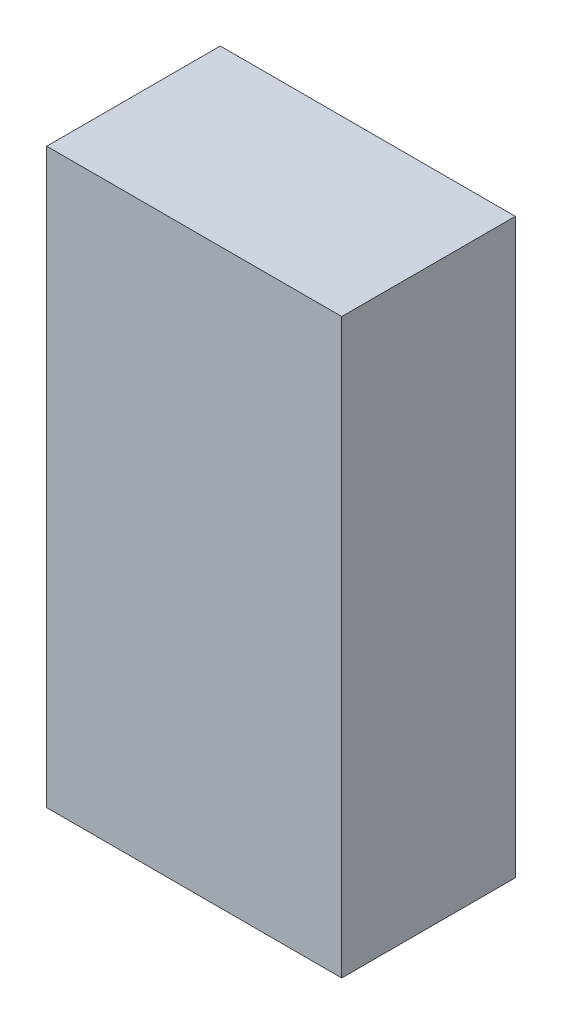
ISO-10303-21;
HEADER;
FILE_DESCRIPTION(('STEP AP214'),'2;1');
FILE_NAME('part.step','',(''),(''),'','','');
FILE_SCHEMA(('AUTOMOTIVE_DESIGN { 1 0 10303 214 1 1 1 1 }'));
ENDSEC;
DATA;
#1=APPLICATION_CONTEXT('core data for automotive mechanical design processes');
#2=APPLICATION_PROTOCOL_DEFINITION('international standard','automotive_design',2000,#1);
#3=PRODUCT_CONTEXT('',#1,'mechanical');
#4=PRODUCT('Part','Part','',(#3));
#5=PRODUCT_RELATED_PRODUCT_CATEGORY('part','',(#4));
#6=PRODUCT_DEFINITION_FORMATION('','',#4);
#7=PRODUCT_DEFINITION_CONTEXT('part definition',#1,'design');
#8=PRODUCT_DEFINITION('design','',#6,#7);
#9=PRODUCT_DEFINITION_SHAPE('','',#8);
#10=(LENGTH_UNIT() NAMED_UNIT(*) SI_UNIT(.MILLI.,.METRE.));
#11=(NAMED_UNIT(*) PLANE_ANGLE_UNIT() SI_UNIT($,.RADIAN.));
#12=(NAMED_UNIT(*) SI_UNIT($,.STERADIAN.) SOLID_ANGLE_UNIT());
#13=UNCERTAINTY_MEASURE_WITH_UNIT(LENGTH_MEASURE(1.E-05),#10,'distance_accuracy_value','');
#14=(GEOMETRIC_REPRESENTATION_CONTEXT(3) GLOBAL_UNCERTAINTY_ASSIGNED_CONTEXT((#13)) GLOBAL_UNIT_ASSIGNED_CONTEXT((#10,
#11,#12)) REPRESENTATION_CONTEXT('',''));
#15=CARTESIAN_POINT('',(0.,0.,0.));
#16=DIRECTION('',(0.,0.,1.));
#17=DIRECTION('',(1.,0.,0.));
#18=AXIS2_PLACEMENT_3D('',#15,#16,#17);
#19=CARTESIAN_POINT('',(-0.85,-1.65,1.));
#20=DIRECTION('',(1.,0.,0.));
#21=DIRECTION('',(0.,0.,-1.));
#22=AXIS2_PLACEMENT_3D('',#19,#20,#21);
#23=PLANE('',#22);
#24=DIRECTION('',(0.,-1.,0.));
#25=VECTOR('',#24,1.);
#26=CARTESIAN_POINT('',(-0.85,-1.65,0.));
#27=LINE('',#26,#25);
#28=CARTESIAN_POINT('',(-0.85,1.6508,0.));
#29=VERTEX_POINT('',#28);
#30=CARTESIAN_POINT('',(-0.85,-1.65,0.));
#31=VERTEX_POINT('',#30);
#32=EDGE_CURVE('E95',#29,#31,#27,.T.);
#33=ORIENTED_EDGE('',*,*,#32,.T.);
#34=DIRECTION('',(0.,0.,-1.));
#35=VECTOR('',#34,1.);
#36=CARTESIAN_POINT('',(-0.85,-1.65,1.));
#37=LINE('',#36,#35);
#38=CARTESIAN_POINT('',(-0.85,-1.65,1.));
#39=VERTEX_POINT('',#38);
#40=EDGE_CURVE('E11',#39,#31,#37,.T.);
#41=ORIENTED_EDGE('',*,*,#40,.F.);
#42=DIRECTION('',(0.,-1.,0.));
#43=VECTOR('',#42,1.);
#44=CARTESIAN_POINT('',(-0.85,-1.65,1.));
#45=LINE('',#44,#43);
#46=CARTESIAN_POINT('',(-0.85,1.6508,1.));
#47=VERTEX_POINT('',#46);
#48=EDGE_CURVE('E83',#47,#39,#45,.T.);
#49=ORIENTED_EDGE('',*,*,#48,.F.);
#50=DIRECTION('',(0.,0.,-1.));
#51=VECTOR('',#50,1.);
#52=CARTESIAN_POINT('',(-0.85,1.6508,1.));
#53=LINE('',#52,#51);
#54=EDGE_CURVE('E91',#47,#29,#53,.T.);
#55=ORIENTED_EDGE('',*,*,#54,.T.);
#56=EDGE_LOOP('',(#33,#41,#49,#55));
#57=FACE_BOUND('',#56,.T.);
#58=ADVANCED_FACE('F32',(#57),#23,.F.);
#59=CARTESIAN_POINT('',(0.85,-1.65,1.));
#60=DIRECTION('',(0.,1.,0.));
#61=DIRECTION('',(0.,0.,1.));
#62=AXIS2_PLACEMENT_3D('',#59,#60,#61);
#63=PLANE('',#62);
#64=DIRECTION('',(1.,0.,0.));
#65=VECTOR('',#64,1.);
#66=CARTESIAN_POINT('',(0.85,-1.65,0.));
#67=LINE('',#66,#65);
#68=CARTESIAN_POINT('',(0.85,-1.65,0.));
#69=VERTEX_POINT('',#68);
#70=EDGE_CURVE('E87',#31,#69,#67,.T.);
#71=ORIENTED_EDGE('',*,*,#70,.T.);
#72=DIRECTION('',(0.,0.,-1.));
#73=VECTOR('',#72,1.);
#74=CARTESIAN_POINT('',(0.85,-1.65,1.));
#75=LINE('',#74,#73);
#76=CARTESIAN_POINT('',(0.85,-1.65,1.));
#77=VERTEX_POINT('',#76);
#78=EDGE_CURVE('E40',#77,#69,#75,.T.);
#79=ORIENTED_EDGE('',*,*,#78,.F.);
#80=DIRECTION('',(1.,0.,0.));
#81=VECTOR('',#80,1.);
#82=CARTESIAN_POINT('',(0.85,-1.65,1.));
#83=LINE('',#82,#81);
#84=EDGE_CURVE('E78',#39,#77,#83,.T.);
#85=ORIENTED_EDGE('',*,*,#84,.F.);
#86=ORIENTED_EDGE('',*,*,#40,.T.);
#87=EDGE_LOOP('',(#71,#79,#85,#86));
#88=FACE_BOUND('',#87,.T.);
#89=ADVANCED_FACE('F86',(#88),#63,.F.);
#90=CARTESIAN_POINT('',(0.85,1.6508,1.));
#91=DIRECTION('',(-1.,0.,0.));
#92=DIRECTION('',(0.,0.,1.));
#93=AXIS2_PLACEMENT_3D('',#90,#91,#92);
#94=PLANE('',#93);
#95=DIRECTION('',(0.,1.,0.));
#96=VECTOR('',#95,1.);
#97=CARTESIAN_POINT('',(0.85,1.6508,0.));
#98=LINE('',#97,#96);
#99=CARTESIAN_POINT('',(0.85,1.6508,0.));
#100=VERTEX_POINT('',#99);
#101=EDGE_CURVE('E65',#69,#100,#98,.T.);
#102=ORIENTED_EDGE('',*,*,#101,.T.);
#103=DIRECTION('',(0.,0.,-1.));
#104=VECTOR('',#103,1.);
#105=CARTESIAN_POINT('',(0.85,1.6508,1.));
#106=LINE('',#105,#104);
#107=CARTESIAN_POINT('',(0.85,1.6508,1.));
#108=VERTEX_POINT('',#107);
#109=EDGE_CURVE('E88',#108,#100,#106,.T.);
#110=ORIENTED_EDGE('',*,*,#109,.F.);
#111=DIRECTION('',(0.,1.,0.));
#112=VECTOR('',#111,1.);
#113=CARTESIAN_POINT('',(0.85,1.6508,1.));
#114=LINE('',#113,#112);
#115=EDGE_CURVE('E81',#77,#108,#114,.T.);
#116=ORIENTED_EDGE('',*,*,#115,.F.);
#117=ORIENTED_EDGE('',*,*,#78,.T.);
#118=EDGE_LOOP('',(#102,#110,#116,#117));
#119=FACE_BOUND('',#118,.T.);
#120=ADVANCED_FACE('F89',(#119),#94,.F.);
#121=CARTESIAN_POINT('',(-0.85,1.6508,1.));
#122=DIRECTION('',(0.,-1.,0.));
#123=DIRECTION('',(0.,0.,-1.));
#124=AXIS2_PLACEMENT_3D('',#121,#122,#123);
#125=PLANE('',#124);
#126=DIRECTION('',(-1.,0.,0.));
#127=VECTOR('',#126,1.);
#128=CARTESIAN_POINT('',(-0.85,1.6508,0.));
#129=LINE('',#128,#127);
#130=EDGE_CURVE('E71',#100,#29,#129,.T.);
#131=ORIENTED_EDGE('',*,*,#130,.T.);
#132=ORIENTED_EDGE('',*,*,#54,.F.);
#133=DIRECTION('',(-1.,0.,0.));
#134=VECTOR('',#133,1.);
#135=CARTESIAN_POINT('',(-0.85,1.6508,1.));
#136=LINE('',#135,#134);
#137=EDGE_CURVE('E48',#108,#47,#136,.T.);
#138=ORIENTED_EDGE('',*,*,#137,.F.);
#139=ORIENTED_EDGE('',*,*,#109,.T.);
#140=EDGE_LOOP('',(#131,#132,#138,#139));
#141=FACE_BOUND('',#140,.T.);
#142=ADVANCED_FACE('F102',(#141),#125,.F.);
#143=CARTESIAN_POINT('',(0.,0.,1.));
#144=DIRECTION('',(0.,0.,-1.));
#145=DIRECTION('',(-1.,0.,0.));
#146=AXIS2_PLACEMENT_3D('',#143,#144,#145);
#147=PLANE('',#146);
#148=ORIENTED_EDGE('',*,*,#48,.T.);
#149=ORIENTED_EDGE('',*,*,#84,.T.);
#150=ORIENTED_EDGE('',*,*,#115,.T.);
#151=ORIENTED_EDGE('',*,*,#137,.T.);
#152=EDGE_LOOP('',(#148,#149,#150,#151));
#153=FACE_BOUND('',#152,.T.);
#154=ADVANCED_FACE('F79',(#153),#147,.F.);
#155=CARTESIAN_POINT('',(0.,0.,0.));
#156=DIRECTION('',(0.,0.,-1.));
#157=DIRECTION('',(-1.,0.,0.));
#158=AXIS2_PLACEMENT_3D('',#155,#156,#157);
#159=PLANE('',#158);
#160=ORIENTED_EDGE('',*,*,#32,.F.);
#161=ORIENTED_EDGE('',*,*,#130,.F.);
#162=ORIENTED_EDGE('',*,*,#101,.F.);
#163=ORIENTED_EDGE('',*,*,#70,.F.);
#164=EDGE_LOOP('',(#160,#161,#162,#163));
#165=FACE_BOUND('',#164,.T.);
#166=ADVANCED_FACE('F105',(#165),#159,.T.);
#167=CLOSED_SHELL('',(#58,#89,#120,#142,#154,#166));
#168=MANIFOLD_SOLID_BREP('B2',#167);
#169=ADVANCED_BREP_SHAPE_REPRESENTATION('',(#18,#168),#14);
#170=SHAPE_DEFINITION_REPRESENTATION(#9,#169);
ENDSEC;
END-ISO-10303-21;
